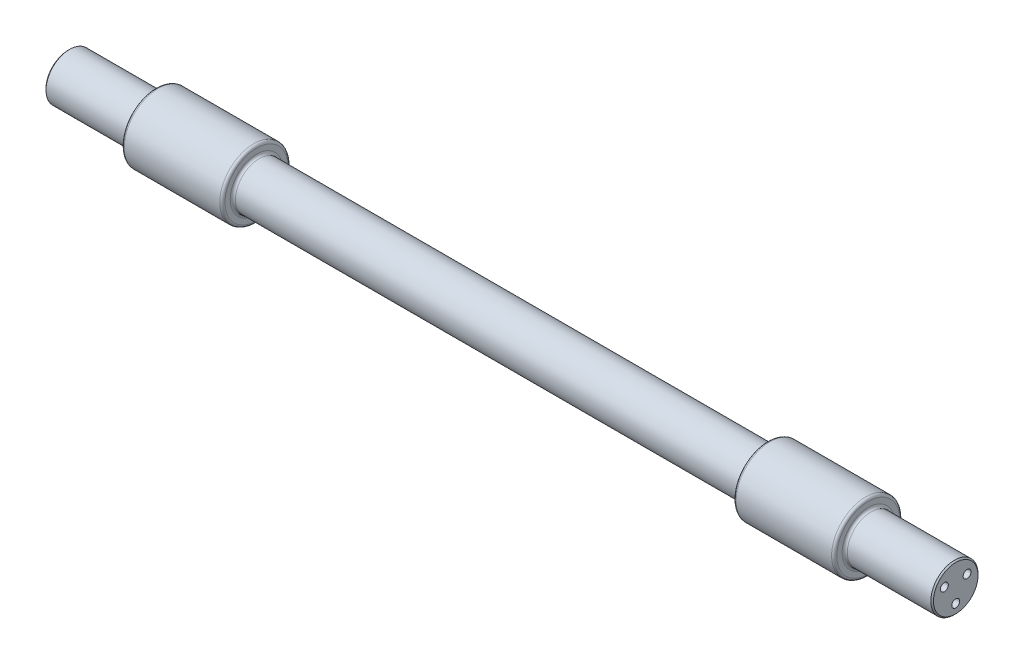
ISO-10303-21;
HEADER;
FILE_DESCRIPTION(('STEP AP214'),'2;1');
FILE_NAME('part.step','',(''),(''),'','','');
FILE_SCHEMA(('AUTOMOTIVE_DESIGN { 1 0 10303 214 1 1 1 1 }'));
ENDSEC;
DATA;
#1=APPLICATION_CONTEXT('core data for automotive mechanical design processes');
#2=APPLICATION_PROTOCOL_DEFINITION('international standard','automotive_design',2000,#1);
#3=PRODUCT_CONTEXT('',#1,'mechanical');
#4=PRODUCT('Part','Part','',(#3));
#5=PRODUCT_RELATED_PRODUCT_CATEGORY('part','',(#4));
#6=PRODUCT_DEFINITION_FORMATION('','',#4);
#7=PRODUCT_DEFINITION_CONTEXT('part definition',#1,'design');
#8=PRODUCT_DEFINITION('design','',#6,#7);
#9=PRODUCT_DEFINITION_SHAPE('','',#8);
#10=(LENGTH_UNIT() NAMED_UNIT(*) SI_UNIT(.MILLI.,.METRE.));
#11=(NAMED_UNIT(*) PLANE_ANGLE_UNIT() SI_UNIT($,.RADIAN.));
#12=(NAMED_UNIT(*) SI_UNIT($,.STERADIAN.) SOLID_ANGLE_UNIT());
#13=UNCERTAINTY_MEASURE_WITH_UNIT(LENGTH_MEASURE(1.E-05),#10,'distance_accuracy_value','');
#14=(GEOMETRIC_REPRESENTATION_CONTEXT(3) GLOBAL_UNCERTAINTY_ASSIGNED_CONTEXT((#13)) GLOBAL_UNIT_ASSIGNED_CONTEXT((#10,
#11,#12)) REPRESENTATION_CONTEXT('',''));
#15=CARTESIAN_POINT('',(0.,0.,0.));
#16=DIRECTION('',(0.,0.,1.));
#17=DIRECTION('',(1.,0.,0.));
#18=AXIS2_PLACEMENT_3D('',#15,#16,#17);
#19=CARTESIAN_POINT('',(0.,89.9999999999997,0.));
#20=DIRECTION('',(1.,0.,0.));
#21=DIRECTION('',(0.,1.,0.));
#22=AXIS2_PLACEMENT_3D('',#19,#20,#21);
#23=PLANE('',#22);
#24=CARTESIAN_POINT('',(0.,0.,0.));
#25=DIRECTION('',(1.,0.,0.));
#26=DIRECTION('',(0.,1.,0.));
#27=AXIS2_PLACEMENT_3D('',#24,#25,#26);
#28=CIRCLE('',#27,85.0000000000009);
#29=CARTESIAN_POINT('',(0.,85.0000000000009,0.));
#30=VERTEX_POINT('',#29);
#31=EDGE_CURVE('E37',#30,#30,#28,.T.);
#32=ORIENTED_EDGE('',*,*,#31,.T.);
#33=EDGE_LOOP('',(#32));
#34=FACE_BOUND('',#33,.T.);
#35=CARTESIAN_POINT('',(0.,25.0000000000002,-43.3012701892218));
#36=DIRECTION('',(-1.,0.,0.));
#37=DIRECTION('',(0.,0.500000000000004,-0.866025403784436));
#38=AXIS2_PLACEMENT_3D('',#35,#36,#37);
#39=CIRCLE('',#38,15.);
#40=CARTESIAN_POINT('',(0.,32.5000000000003,-56.2916512459884));
#41=VERTEX_POINT('',#40);
#42=EDGE_CURVE('E123',#41,#41,#39,.T.);
#43=ORIENTED_EDGE('',*,*,#42,.T.);
#44=EDGE_LOOP('',(#43));
#45=FACE_BOUND('',#44,.T.);
#46=CARTESIAN_POINT('',(0.,-50.,0.));
#47=DIRECTION('',(-1.,0.,0.));
#48=DIRECTION('',(0.,-1.,0.));
#49=AXIS2_PLACEMENT_3D('',#46,#47,#48);
#50=CIRCLE('',#49,15.);
#51=CARTESIAN_POINT('',(0.,-65.,0.));
#52=VERTEX_POINT('',#51);
#53=EDGE_CURVE('E117',#52,#52,#50,.T.);
#54=ORIENTED_EDGE('',*,*,#53,.T.);
#55=EDGE_LOOP('',(#54));
#56=FACE_BOUND('',#55,.T.);
#57=CARTESIAN_POINT('',(0.,24.9999999999996,43.3012701892222));
#58=DIRECTION('',(-1.,0.,0.));
#59=DIRECTION('',(0.,0.499999999999992,0.866025403784443));
#60=AXIS2_PLACEMENT_3D('',#57,#58,#59);
#61=CIRCLE('',#60,15.);
#62=CARTESIAN_POINT('',(0.,32.4999999999995,56.2916512459888));
#63=VERTEX_POINT('',#62);
#64=EDGE_CURVE('E129',#63,#63,#61,.T.);
#65=ORIENTED_EDGE('',*,*,#64,.T.);
#66=EDGE_LOOP('',(#65));
#67=FACE_BOUND('',#66,.T.);
#68=ADVANCED_FACE('F30',(#34,#45,#56,#67),#23,.T.);
#69=CARTESIAN_POINT('',(-3385.,-4.14542941511379E-13,0.));
#70=DIRECTION('',(-1.,0.,0.));
#71=DIRECTION('',(0.,-1.,0.));
#72=AXIS2_PLACEMENT_3D('',#69,#70,#71);
#73=PLANE('',#72);
#74=CARTESIAN_POINT('',(-3385.,-4.14542941511379E-13,0.));
#75=DIRECTION('',(-1.,0.,0.));
#76=DIRECTION('',(0.,-1.,0.));
#77=AXIS2_PLACEMENT_3D('',#74,#75,#76);
#78=CIRCLE('',#77,84.9999999999991);
#79=CARTESIAN_POINT('',(-3385.,-84.9999999999995,0.));
#80=VERTEX_POINT('',#79);
#81=EDGE_CURVE('E41',#80,#80,#78,.T.);
#82=ORIENTED_EDGE('',*,*,#81,.T.);
#83=EDGE_LOOP('',(#82));
#84=FACE_BOUND('',#83,.T.);
#85=CARTESIAN_POINT('',(-3385.,24.9999999999992,43.3012701892222));
#86=DIRECTION('',(-1.,0.,0.));
#87=DIRECTION('',(0.,0.499999999999992,0.866025403784443));
#88=AXIS2_PLACEMENT_3D('',#85,#86,#87);
#89=CIRCLE('',#88,15.);
#90=CARTESIAN_POINT('',(-3385.,32.4999999999991,56.2916512459888));
#91=VERTEX_POINT('',#90);
#92=EDGE_CURVE('E111',#91,#91,#89,.T.);
#93=ORIENTED_EDGE('',*,*,#92,.F.);
#94=EDGE_LOOP('',(#93));
#95=FACE_BOUND('',#94,.T.);
#96=CARTESIAN_POINT('',(-3385.,24.9999999999998,-43.3012701892218));
#97=DIRECTION('',(-1.,0.,0.));
#98=DIRECTION('',(0.,0.500000000000004,-0.866025403784436));
#99=AXIS2_PLACEMENT_3D('',#96,#97,#98);
#100=CIRCLE('',#99,15.);
#101=CARTESIAN_POINT('',(-3385.,32.4999999999999,-56.2916512459884));
#102=VERTEX_POINT('',#101);
#103=EDGE_CURVE('E105',#102,#102,#100,.T.);
#104=ORIENTED_EDGE('',*,*,#103,.F.);
#105=EDGE_LOOP('',(#104));
#106=FACE_BOUND('',#105,.T.);
#107=CARTESIAN_POINT('',(-3385.,-50.0000000000004,0.));
#108=DIRECTION('',(-1.,0.,0.));
#109=DIRECTION('',(0.,-1.,0.));
#110=AXIS2_PLACEMENT_3D('',#107,#108,#109);
#111=CIRCLE('',#110,15.);
#112=CARTESIAN_POINT('',(-3385.,-65.0000000000004,0.));
#113=VERTEX_POINT('',#112);
#114=EDGE_CURVE('E99',#113,#113,#111,.T.);
#115=ORIENTED_EDGE('',*,*,#114,.F.);
#116=EDGE_LOOP('',(#115));
#117=FACE_BOUND('',#116,.T.);
#118=ADVANCED_FACE('F152',(#84,#95,#106,#117),#73,.T.);
#119=CARTESIAN_POINT('',(0.,0.,0.));
#120=DIRECTION('',(1.,0.,0.));
#121=DIRECTION('',(0.,1.,0.));
#122=AXIS2_PLACEMENT_3D('',#119,#120,#121);
#123=CYLINDRICAL_SURFACE('',#122,90.0000000000001);
#124=CARTESIAN_POINT('',(-3380.,-4.13930618111805E-13,0.));
#125=DIRECTION('',(-1.,0.,0.));
#126=DIRECTION('',(0.,-1.,0.));
#127=AXIS2_PLACEMENT_3D('',#124,#125,#126);
#128=CIRCLE('',#127,90.0000000000001);
#129=CARTESIAN_POINT('',(-3380.,-90.0000000000005,0.));
#130=VERTEX_POINT('',#129);
#131=EDGE_CURVE('E45',#130,#130,#128,.F.);
#132=ORIENTED_EDGE('',*,*,#131,.T.);
#133=EDGE_LOOP('',(#132));
#134=FACE_BOUND('',#133,.T.);
#135=CARTESIAN_POINT('',(-3061.5,-3.74925617558962E-13,0.));
#136=DIRECTION('',(-1.,0.,0.));
#137=DIRECTION('',(0.,-1.,0.));
#138=AXIS2_PLACEMENT_3D('',#135,#136,#137);
#139=CIRCLE('',#138,90.0000000000001);
#140=CARTESIAN_POINT('',(-3061.5,-90.0000000000004,0.));
#141=VERTEX_POINT('',#140);
#142=EDGE_CURVE('E71',#141,#141,#139,.T.);
#143=ORIENTED_EDGE('',*,*,#142,.T.);
#144=EDGE_LOOP('',(#143));
#145=FACE_BOUND('',#144,.T.);
#146=ADVANCED_FACE('F157',(#134,#145),#123,.T.);
#147=CARTESIAN_POINT('',(-3051.5,89.9999999999997,0.));
#148=DIRECTION('',(-1.,0.,0.));
#149=DIRECTION('',(0.,-1.,0.));
#150=AXIS2_PLACEMENT_3D('',#147,#148,#149);
#151=PLANE('',#150);
#152=CARTESIAN_POINT('',(-3051.5,-3.73700970759815E-13,0.));
#153=DIRECTION('',(-1.,0.,0.));
#154=DIRECTION('',(0.,-1.,0.));
#155=AXIS2_PLACEMENT_3D('',#152,#153,#154);
#156=CIRCLE('',#155,120.);
#157=CARTESIAN_POINT('',(-3051.5,-120.,0.));
#158=VERTEX_POINT('',#157);
#159=EDGE_CURVE('E74',#158,#158,#156,.T.);
#160=ORIENTED_EDGE('',*,*,#159,.T.);
#161=EDGE_LOOP('',(#160));
#162=FACE_BOUND('',#161,.T.);
#163=CARTESIAN_POINT('',(-3051.5,-3.73700970759815E-13,0.));
#164=DIRECTION('',(-1.,0.,0.));
#165=DIRECTION('',(0.,-1.,0.));
#166=AXIS2_PLACEMENT_3D('',#163,#164,#165);
#167=CIRCLE('',#166,100.);
#168=CARTESIAN_POINT('',(-3051.5,-100.,0.));
#169=VERTEX_POINT('',#168);
#170=EDGE_CURVE('E77',#169,#169,#167,.F.);
#171=ORIENTED_EDGE('',*,*,#170,.T.);
#172=EDGE_LOOP('',(#171));
#173=FACE_BOUND('',#172,.T.);
#174=ADVANCED_FACE('F202',(#162,#173),#151,.T.);
#175=CARTESIAN_POINT('',(0.,0.,0.));
#176=DIRECTION('',(1.,0.,0.));
#177=DIRECTION('',(0.,1.,0.));
#178=AXIS2_PLACEMENT_3D('',#175,#176,#177);
#179=CYLINDRICAL_SURFACE('',#178,130.);
#180=CARTESIAN_POINT('',(-2677.25,-3.27868564301725E-13,0.));
#181=DIRECTION('',(1.,0.,0.));
#182=DIRECTION('',(0.,1.,0.));
#183=AXIS2_PLACEMENT_3D('',#180,#181,#182);
#184=CIRCLE('',#183,130.);
#185=CARTESIAN_POINT('',(-2677.25,130.,0.));
#186=VERTEX_POINT('',#185);
#187=EDGE_CURVE('E80',#186,#186,#184,.F.);
#188=ORIENTED_EDGE('',*,*,#187,.T.);
#189=EDGE_LOOP('',(#188));
#190=FACE_BOUND('',#189,.T.);
#191=CARTESIAN_POINT('',(-3041.5,-3.72476323960667E-13,0.));
#192=DIRECTION('',(-1.,0.,0.));
#193=DIRECTION('',(0.,-1.,0.));
#194=AXIS2_PLACEMENT_3D('',#191,#192,#193);
#195=CIRCLE('',#194,130.);
#196=CARTESIAN_POINT('',(-3041.5,-130.,0.));
#197=VERTEX_POINT('',#196);
#198=EDGE_CURVE('E83',#197,#197,#195,.F.);
#199=ORIENTED_EDGE('',*,*,#198,.T.);
#200=EDGE_LOOP('',(#199));
#201=FACE_BOUND('',#200,.T.);
#202=ADVANCED_FACE('F208',(#190,#201),#179,.T.);
#203=CARTESIAN_POINT('',(-2667.25,130.,0.));
#204=DIRECTION('',(1.,0.,0.));
#205=DIRECTION('',(0.,1.,0.));
#206=AXIS2_PLACEMENT_3D('',#203,#204,#205);
#207=PLANE('',#206);
#208=CARTESIAN_POINT('',(-2667.25,-3.26643917502578E-13,0.));
#209=DIRECTION('',(1.,0.,0.));
#210=DIRECTION('',(0.,1.,0.));
#211=AXIS2_PLACEMENT_3D('',#208,#209,#210);
#212=CIRCLE('',#211,99.9999999999999);
#213=CARTESIAN_POINT('',(-2667.25,99.9999999999995,0.));
#214=VERTEX_POINT('',#213);
#215=EDGE_CURVE('E86',#214,#214,#212,.F.);
#216=ORIENTED_EDGE('',*,*,#215,.T.);
#217=EDGE_LOOP('',(#216));
#218=FACE_BOUND('',#217,.T.);
#219=CARTESIAN_POINT('',(-2667.25,-3.26643917502578E-13,0.));
#220=DIRECTION('',(1.,0.,0.));
#221=DIRECTION('',(0.,1.,0.));
#222=AXIS2_PLACEMENT_3D('',#219,#220,#221);
#223=CIRCLE('',#222,120.);
#224=CARTESIAN_POINT('',(-2667.25,120.,0.));
#225=VERTEX_POINT('',#224);
#226=EDGE_CURVE('E89',#225,#225,#223,.T.);
#227=ORIENTED_EDGE('',*,*,#226,.T.);
#228=EDGE_LOOP('',(#227));
#229=FACE_BOUND('',#228,.T.);
#230=ADVANCED_FACE('F214',(#218,#229),#207,.T.);
#231=CARTESIAN_POINT('',(0.,0.,0.));
#232=DIRECTION('',(1.,0.,0.));
#233=DIRECTION('',(0.,1.,0.));
#234=AXIS2_PLACEMENT_3D('',#231,#232,#233);
#235=CYLINDRICAL_SURFACE('',#234,89.9999999999999);
#236=CARTESIAN_POINT('',(-2657.25,-3.2541927070343E-13,0.));
#237=DIRECTION('',(1.,0.,0.));
#238=DIRECTION('',(0.,1.,0.));
#239=AXIS2_PLACEMENT_3D('',#236,#237,#238);
#240=CIRCLE('',#239,89.9999999999999);
#241=CARTESIAN_POINT('',(-2657.25,89.9999999999996,0.));
#242=VERTEX_POINT('',#241);
#243=EDGE_CURVE('E92',#242,#242,#240,.T.);
#244=ORIENTED_EDGE('',*,*,#243,.T.);
#245=EDGE_LOOP('',(#244));
#246=FACE_BOUND('',#245,.T.);
#247=CARTESIAN_POINT('',(-727.75,0.,0.));
#248=DIRECTION('',(-1.,0.,0.));
#249=DIRECTION('',(0.,-1.,0.));
#250=AXIS2_PLACEMENT_3D('',#247,#248,#249);
#251=CIRCLE('',#250,89.9999999999999);
#252=CARTESIAN_POINT('',(-727.75,-90.,0.));
#253=VERTEX_POINT('',#252);
#254=EDGE_CURVE('E95',#253,#253,#251,.T.);
#255=ORIENTED_EDGE('',*,*,#254,.T.);
#256=EDGE_LOOP('',(#255));
#257=FACE_BOUND('',#256,.T.);
#258=ADVANCED_FACE('F220',(#246,#257),#235,.T.);
#259=CARTESIAN_POINT('',(-717.75,89.9999999999997,0.));
#260=DIRECTION('',(-1.,0.,0.));
#261=DIRECTION('',(0.,-1.,0.));
#262=AXIS2_PLACEMENT_3D('',#259,#260,#261);
#263=PLANE('',#262);
#264=CARTESIAN_POINT('',(-717.75,0.,0.));
#265=DIRECTION('',(-1.,0.,0.));
#266=DIRECTION('',(0.,-1.,0.));
#267=AXIS2_PLACEMENT_3D('',#264,#265,#266);
#268=CIRCLE('',#267,120.);
#269=CARTESIAN_POINT('',(-717.75,-120.,0.));
#270=VERTEX_POINT('',#269);
#271=EDGE_CURVE('E59',#270,#270,#268,.T.);
#272=ORIENTED_EDGE('',*,*,#271,.T.);
#273=EDGE_LOOP('',(#272));
#274=FACE_BOUND('',#273,.T.);
#275=CARTESIAN_POINT('',(-717.75,0.,0.));
#276=DIRECTION('',(-1.,0.,0.));
#277=DIRECTION('',(0.,-1.,0.));
#278=AXIS2_PLACEMENT_3D('',#275,#276,#277);
#279=CIRCLE('',#278,99.9999999999999);
#280=CARTESIAN_POINT('',(-717.75,-100.,0.));
#281=VERTEX_POINT('',#280);
#282=EDGE_CURVE('E62',#281,#281,#279,.F.);
#283=ORIENTED_EDGE('',*,*,#282,.T.);
#284=EDGE_LOOP('',(#283));
#285=FACE_BOUND('',#284,.T.);
#286=ADVANCED_FACE('F224',(#274,#285),#263,.T.);
#287=CARTESIAN_POINT('',(0.,0.,0.));
#288=DIRECTION('',(1.,0.,0.));
#289=DIRECTION('',(0.,1.,0.));
#290=AXIS2_PLACEMENT_3D('',#287,#288,#289);
#291=CYLINDRICAL_SURFACE('',#290,130.);
#292=CARTESIAN_POINT('',(-707.75,0.,0.));
#293=DIRECTION('',(-1.,0.,0.));
#294=DIRECTION('',(0.,-1.,0.));
#295=AXIS2_PLACEMENT_3D('',#292,#293,#294);
#296=CIRCLE('',#295,130.);
#297=CARTESIAN_POINT('',(-707.75,-130.,0.));
#298=VERTEX_POINT('',#297);
#299=EDGE_CURVE('E65',#298,#298,#296,.F.);
#300=ORIENTED_EDGE('',*,*,#299,.T.);
#301=EDGE_LOOP('',(#300));
#302=FACE_BOUND('',#301,.T.);
#303=CARTESIAN_POINT('',(-343.5,0.,0.));
#304=DIRECTION('',(1.,0.,0.));
#305=DIRECTION('',(0.,1.,0.));
#306=AXIS2_PLACEMENT_3D('',#303,#304,#305);
#307=CIRCLE('',#306,130.);
#308=CARTESIAN_POINT('',(-343.5,130.,0.));
#309=VERTEX_POINT('',#308);
#310=EDGE_CURVE('E68',#309,#309,#307,.F.);
#311=ORIENTED_EDGE('',*,*,#310,.T.);
#312=EDGE_LOOP('',(#311));
#313=FACE_BOUND('',#312,.T.);
#314=ADVANCED_FACE('F228',(#302,#313),#291,.T.);
#315=CARTESIAN_POINT('',(-333.5,130.,0.));
#316=DIRECTION('',(1.,0.,0.));
#317=DIRECTION('',(0.,1.,0.));
#318=AXIS2_PLACEMENT_3D('',#315,#316,#317);
#319=PLANE('',#318);
#320=CARTESIAN_POINT('',(-333.5,0.,0.));
#321=DIRECTION('',(1.,0.,0.));
#322=DIRECTION('',(0.,1.,0.));
#323=AXIS2_PLACEMENT_3D('',#320,#321,#322);
#324=CIRCLE('',#323,99.9999999999997);
#325=CARTESIAN_POINT('',(-333.5,99.9999999999997,0.));
#326=VERTEX_POINT('',#325);
#327=EDGE_CURVE('E50',#326,#326,#324,.F.);
#328=ORIENTED_EDGE('',*,*,#327,.T.);
#329=EDGE_LOOP('',(#328));
#330=FACE_BOUND('',#329,.T.);
#331=CARTESIAN_POINT('',(-333.5,0.,0.));
#332=DIRECTION('',(1.,0.,0.));
#333=DIRECTION('',(0.,1.,0.));
#334=AXIS2_PLACEMENT_3D('',#331,#332,#333);
#335=CIRCLE('',#334,120.);
#336=CARTESIAN_POINT('',(-333.5,120.,0.));
#337=VERTEX_POINT('',#336);
#338=EDGE_CURVE('E53',#337,#337,#335,.T.);
#339=ORIENTED_EDGE('',*,*,#338,.T.);
#340=EDGE_LOOP('',(#339));
#341=FACE_BOUND('',#340,.T.);
#342=ADVANCED_FACE('F232',(#330,#341),#319,.T.);
#343=CARTESIAN_POINT('',(0.,0.,0.));
#344=DIRECTION('',(1.,0.,0.));
#345=DIRECTION('',(0.,1.,0.));
#346=AXIS2_PLACEMENT_3D('',#343,#344,#345);
#347=CYLINDRICAL_SURFACE('',#346,89.9999999999997);
#348=CARTESIAN_POINT('',(-4.99999999999907,0.,0.));
#349=DIRECTION('',(1.,0.,0.));
#350=DIRECTION('',(0.,1.,0.));
#351=AXIS2_PLACEMENT_3D('',#348,#349,#350);
#352=CIRCLE('',#351,89.9999999999997);
#353=CARTESIAN_POINT('',(-4.99999999999908,89.9999999999997,0.));
#354=VERTEX_POINT('',#353);
#355=EDGE_CURVE('E10',#354,#354,#352,.F.);
#356=ORIENTED_EDGE('',*,*,#355,.T.);
#357=EDGE_LOOP('',(#356));
#358=FACE_BOUND('',#357,.T.);
#359=CARTESIAN_POINT('',(-323.5,0.,0.));
#360=DIRECTION('',(1.,0.,0.));
#361=DIRECTION('',(0.,1.,0.));
#362=AXIS2_PLACEMENT_3D('',#359,#360,#361);
#363=CIRCLE('',#362,89.9999999999997);
#364=CARTESIAN_POINT('',(-323.5,89.9999999999997,0.));
#365=VERTEX_POINT('',#364);
#366=EDGE_CURVE('E56',#365,#365,#363,.T.);
#367=ORIENTED_EDGE('',*,*,#366,.T.);
#368=EDGE_LOOP('',(#367));
#369=FACE_BOUND('',#368,.T.);
#370=ADVANCED_FACE('F236',(#358,#369),#347,.T.);
#371=CARTESIAN_POINT('',(-3335.,-50.0000000000004,0.));
#372=DIRECTION('',(-1.,0.,0.));
#373=DIRECTION('',(0.,-1.,0.));
#374=AXIS2_PLACEMENT_3D('',#371,#372,#373);
#375=CYLINDRICAL_SURFACE('',#374,15.);
#376=CARTESIAN_POINT('',(-3335.,-50.0000000000004,0.));
#377=DIRECTION('',(-1.,0.,0.));
#378=DIRECTION('',(0.,-1.,0.));
#379=AXIS2_PLACEMENT_3D('',#376,#377,#378);
#380=CIRCLE('',#379,15.);
#381=CARTESIAN_POINT('',(-3335.,-65.0000000000004,0.));
#382=VERTEX_POINT('',#381);
#383=EDGE_CURVE('E98',#382,#382,#380,.T.);
#384=ORIENTED_EDGE('',*,*,#383,.F.);
#385=EDGE_LOOP('',(#384));
#386=FACE_BOUND('',#385,.T.);
#387=ORIENTED_EDGE('',*,*,#114,.T.);
#388=EDGE_LOOP('',(#387));
#389=FACE_BOUND('',#388,.T.);
#390=ADVANCED_FACE('F240',(#386,#389),#375,.F.);
#391=CARTESIAN_POINT('',(-3335.,-50.0000000000004,0.));
#392=DIRECTION('',(-1.,0.,0.));
#393=DIRECTION('',(0.,-1.,0.));
#394=AXIS2_PLACEMENT_3D('',#391,#392,#393);
#395=PLANE('',#394);
#396=ORIENTED_EDGE('',*,*,#383,.T.);
#397=EDGE_LOOP('',(#396));
#398=FACE_BOUND('',#397,.T.);
#399=ADVANCED_FACE('F243',(#398),#395,.T.);
#400=CARTESIAN_POINT('',(-3335.,24.9999999999998,-43.3012701892218));
#401=DIRECTION('',(-1.,0.,0.));
#402=DIRECTION('',(0.,-1.,0.));
#403=AXIS2_PLACEMENT_3D('',#400,#401,#402);
#404=CYLINDRICAL_SURFACE('',#403,15.);
#405=CARTESIAN_POINT('',(-3335.,24.9999999999998,-43.3012701892218));
#406=DIRECTION('',(-1.,0.,0.));
#407=DIRECTION('',(0.,0.500000000000004,-0.866025403784436));
#408=AXIS2_PLACEMENT_3D('',#405,#406,#407);
#409=CIRCLE('',#408,15.);
#410=CARTESIAN_POINT('',(-3335.,32.4999999999999,-56.2916512459884));
#411=VERTEX_POINT('',#410);
#412=EDGE_CURVE('E102',#411,#411,#409,.T.);
#413=ORIENTED_EDGE('',*,*,#412,.F.);
#414=EDGE_LOOP('',(#413));
#415=FACE_BOUND('',#414,.T.);
#416=ORIENTED_EDGE('',*,*,#103,.T.);
#417=EDGE_LOOP('',(#416));
#418=FACE_BOUND('',#417,.T.);
#419=ADVANCED_FACE('F247',(#415,#418),#404,.F.);
#420=CARTESIAN_POINT('',(-3335.,24.9999999999998,-43.3012701892218));
#421=DIRECTION('',(-1.,0.,0.));
#422=DIRECTION('',(0.,0.500000000000004,-0.866025403784436));
#423=AXIS2_PLACEMENT_3D('',#420,#421,#422);
#424=PLANE('',#423);
#425=ORIENTED_EDGE('',*,*,#412,.T.);
#426=EDGE_LOOP('',(#425));
#427=FACE_BOUND('',#426,.T.);
#428=ADVANCED_FACE('F251',(#427),#424,.T.);
#429=CARTESIAN_POINT('',(-3335.,24.9999999999992,43.3012701892222));
#430=DIRECTION('',(-1.,0.,0.));
#431=DIRECTION('',(0.,-1.,0.));
#432=AXIS2_PLACEMENT_3D('',#429,#430,#431);
#433=CYLINDRICAL_SURFACE('',#432,15.);
#434=CARTESIAN_POINT('',(-3335.,24.9999999999992,43.3012701892222));
#435=DIRECTION('',(-1.,0.,0.));
#436=DIRECTION('',(0.,0.499999999999992,0.866025403784443));
#437=AXIS2_PLACEMENT_3D('',#434,#435,#436);
#438=CIRCLE('',#437,15.);
#439=CARTESIAN_POINT('',(-3335.,32.4999999999991,56.2916512459888));
#440=VERTEX_POINT('',#439);
#441=EDGE_CURVE('E108',#440,#440,#438,.T.);
#442=ORIENTED_EDGE('',*,*,#441,.F.);
#443=EDGE_LOOP('',(#442));
#444=FACE_BOUND('',#443,.T.);
#445=ORIENTED_EDGE('',*,*,#92,.T.);
#446=EDGE_LOOP('',(#445));
#447=FACE_BOUND('',#446,.T.);
#448=ADVANCED_FACE('F255',(#444,#447),#433,.F.);
#449=CARTESIAN_POINT('',(-3335.,24.9999999999992,43.3012701892222));
#450=DIRECTION('',(-1.,0.,0.));
#451=DIRECTION('',(0.,0.499999999999992,0.866025403784443));
#452=AXIS2_PLACEMENT_3D('',#449,#450,#451);
#453=PLANE('',#452);
#454=ORIENTED_EDGE('',*,*,#441,.T.);
#455=EDGE_LOOP('',(#454));
#456=FACE_BOUND('',#455,.T.);
#457=ADVANCED_FACE('F259',(#456),#453,.T.);
#458=CARTESIAN_POINT('',(-50.,-50.,0.));
#459=DIRECTION('',(1.,0.,0.));
#460=DIRECTION('',(0.,1.,0.));
#461=AXIS2_PLACEMENT_3D('',#458,#459,#460);
#462=CYLINDRICAL_SURFACE('',#461,15.);
#463=CARTESIAN_POINT('',(-50.,-50.,0.));
#464=DIRECTION('',(-1.,0.,0.));
#465=DIRECTION('',(0.,-1.,0.));
#466=AXIS2_PLACEMENT_3D('',#463,#464,#465);
#467=CIRCLE('',#466,15.);
#468=CARTESIAN_POINT('',(-50.,-65.,0.));
#469=VERTEX_POINT('',#468);
#470=EDGE_CURVE('E114',#469,#469,#467,.T.);
#471=ORIENTED_EDGE('',*,*,#470,.T.);
#472=EDGE_LOOP('',(#471));
#473=FACE_BOUND('',#472,.T.);
#474=ORIENTED_EDGE('',*,*,#53,.F.);
#475=EDGE_LOOP('',(#474));
#476=FACE_BOUND('',#475,.T.);
#477=ADVANCED_FACE('F263',(#473,#476),#462,.F.);
#478=CARTESIAN_POINT('',(-50.,-50.,0.));
#479=DIRECTION('',(1.,0.,0.));
#480=DIRECTION('',(0.,-1.,0.));
#481=AXIS2_PLACEMENT_3D('',#478,#479,#480);
#482=PLANE('',#481);
#483=ORIENTED_EDGE('',*,*,#470,.F.);
#484=EDGE_LOOP('',(#483));
#485=FACE_BOUND('',#484,.T.);
#486=ADVANCED_FACE('F267',(#485),#482,.T.);
#487=CARTESIAN_POINT('',(-50.,25.0000000000002,-43.3012701892218));
#488=DIRECTION('',(1.,0.,0.));
#489=DIRECTION('',(0.,1.,0.));
#490=AXIS2_PLACEMENT_3D('',#487,#488,#489);
#491=CYLINDRICAL_SURFACE('',#490,15.);
#492=CARTESIAN_POINT('',(-50.,25.0000000000002,-43.3012701892218));
#493=DIRECTION('',(-1.,0.,0.));
#494=DIRECTION('',(0.,0.500000000000004,-0.866025403784436));
#495=AXIS2_PLACEMENT_3D('',#492,#493,#494);
#496=CIRCLE('',#495,15.);
#497=CARTESIAN_POINT('',(-50.,32.5000000000003,-56.2916512459884));
#498=VERTEX_POINT('',#497);
#499=EDGE_CURVE('E120',#498,#498,#496,.T.);
#500=ORIENTED_EDGE('',*,*,#499,.T.);
#501=EDGE_LOOP('',(#500));
#502=FACE_BOUND('',#501,.T.);
#503=ORIENTED_EDGE('',*,*,#42,.F.);
#504=EDGE_LOOP('',(#503));
#505=FACE_BOUND('',#504,.T.);
#506=ADVANCED_FACE('F271',(#502,#505),#491,.F.);
#507=CARTESIAN_POINT('',(-50.,25.0000000000002,-43.3012701892218));
#508=DIRECTION('',(1.,0.,0.));
#509=DIRECTION('',(0.,0.500000000000004,-0.866025403784436));
#510=AXIS2_PLACEMENT_3D('',#507,#508,#509);
#511=PLANE('',#510);
#512=ORIENTED_EDGE('',*,*,#499,.F.);
#513=EDGE_LOOP('',(#512));
#514=FACE_BOUND('',#513,.T.);
#515=ADVANCED_FACE('F149',(#514),#511,.T.);
#516=CARTESIAN_POINT('',(-50.,24.9999999999996,43.3012701892222));
#517=DIRECTION('',(1.,0.,0.));
#518=DIRECTION('',(0.,1.,0.));
#519=AXIS2_PLACEMENT_3D('',#516,#517,#518);
#520=CYLINDRICAL_SURFACE('',#519,15.);
#521=CARTESIAN_POINT('',(-50.,24.9999999999996,43.3012701892222));
#522=DIRECTION('',(-1.,0.,0.));
#523=DIRECTION('',(0.,0.499999999999992,0.866025403784443));
#524=AXIS2_PLACEMENT_3D('',#521,#522,#523);
#525=CIRCLE('',#524,15.);
#526=CARTESIAN_POINT('',(-50.,32.4999999999995,56.2916512459888));
#527=VERTEX_POINT('',#526);
#528=EDGE_CURVE('E126',#527,#527,#525,.T.);
#529=ORIENTED_EDGE('',*,*,#528,.T.);
#530=EDGE_LOOP('',(#529));
#531=FACE_BOUND('',#530,.T.);
#532=ORIENTED_EDGE('',*,*,#64,.F.);
#533=EDGE_LOOP('',(#532));
#534=FACE_BOUND('',#533,.T.);
#535=ADVANCED_FACE('F135',(#531,#534),#520,.F.);
#536=CARTESIAN_POINT('',(-50.,24.9999999999996,43.3012701892222));
#537=DIRECTION('',(1.,0.,0.));
#538=DIRECTION('',(0.,0.499999999999992,0.866025403784443));
#539=AXIS2_PLACEMENT_3D('',#536,#537,#538);
#540=PLANE('',#539);
#541=ORIENTED_EDGE('',*,*,#528,.F.);
#542=EDGE_LOOP('',(#541));
#543=FACE_BOUND('',#542,.T.);
#544=ADVANCED_FACE('F138',(#543),#540,.T.);
#545=CARTESIAN_POINT('',(-2657.25,-3.2541927070343E-13,0.));
#546=DIRECTION('',(1.,0.,0.));
#547=DIRECTION('',(0.,1.,0.));
#548=AXIS2_PLACEMENT_3D('',#545,#546,#547);
#549=TOROIDAL_SURFACE('',#548,99.9999999999999,10.);
#550=ORIENTED_EDGE('',*,*,#215,.F.);
#551=EDGE_LOOP('',(#550));
#552=FACE_BOUND('',#551,.T.);
#553=ORIENTED_EDGE('',*,*,#243,.F.);
#554=EDGE_LOOP('',(#553));
#555=FACE_BOUND('',#554,.T.);
#556=ADVANCED_FACE('F140',(#552,#555),#549,.F.);
#557=CARTESIAN_POINT('',(-2677.25,-3.27868564301725E-13,0.));
#558=DIRECTION('',(1.,0.,0.));
#559=DIRECTION('',(0.,1.,0.));
#560=AXIS2_PLACEMENT_3D('',#557,#558,#559);
#561=TOROIDAL_SURFACE('',#560,120.,10.);
#562=ORIENTED_EDGE('',*,*,#187,.F.);
#563=EDGE_LOOP('',(#562));
#564=FACE_BOUND('',#563,.T.);
#565=ORIENTED_EDGE('',*,*,#226,.F.);
#566=EDGE_LOOP('',(#565));
#567=FACE_BOUND('',#566,.T.);
#568=ADVANCED_FACE('F146',(#564,#567),#561,.T.);
#569=CARTESIAN_POINT('',(-3041.5,-3.72476323960667E-13,0.));
#570=DIRECTION('',(-1.,0.,0.));
#571=DIRECTION('',(0.,-1.,0.));
#572=AXIS2_PLACEMENT_3D('',#569,#570,#571);
#573=TOROIDAL_SURFACE('',#572,120.,10.);
#574=ORIENTED_EDGE('',*,*,#159,.F.);
#575=EDGE_LOOP('',(#574));
#576=FACE_BOUND('',#575,.T.);
#577=ORIENTED_EDGE('',*,*,#198,.F.);
#578=EDGE_LOOP('',(#577));
#579=FACE_BOUND('',#578,.T.);
#580=ADVANCED_FACE('F165',(#576,#579),#573,.T.);
#581=CARTESIAN_POINT('',(-3061.5,-3.74925617558962E-13,0.));
#582=DIRECTION('',(-1.,0.,0.));
#583=DIRECTION('',(0.,-1.,0.));
#584=AXIS2_PLACEMENT_3D('',#581,#582,#583);
#585=TOROIDAL_SURFACE('',#584,100.,10.);
#586=ORIENTED_EDGE('',*,*,#142,.F.);
#587=EDGE_LOOP('',(#586));
#588=FACE_BOUND('',#587,.T.);
#589=ORIENTED_EDGE('',*,*,#170,.F.);
#590=EDGE_LOOP('',(#589));
#591=FACE_BOUND('',#590,.T.);
#592=ADVANCED_FACE('F169',(#588,#591),#585,.F.);
#593=CARTESIAN_POINT('',(-707.75,0.,0.));
#594=DIRECTION('',(-1.,0.,0.));
#595=DIRECTION('',(0.,-1.,0.));
#596=AXIS2_PLACEMENT_3D('',#593,#594,#595);
#597=TOROIDAL_SURFACE('',#596,120.,10.);
#598=ORIENTED_EDGE('',*,*,#271,.F.);
#599=EDGE_LOOP('',(#598));
#600=FACE_BOUND('',#599,.T.);
#601=ORIENTED_EDGE('',*,*,#299,.F.);
#602=EDGE_LOOP('',(#601));
#603=FACE_BOUND('',#602,.T.);
#604=ADVANCED_FACE('F173',(#600,#603),#597,.T.);
#605=CARTESIAN_POINT('',(-727.75,0.,0.));
#606=DIRECTION('',(-1.,0.,0.));
#607=DIRECTION('',(0.,-1.,0.));
#608=AXIS2_PLACEMENT_3D('',#605,#606,#607);
#609=TOROIDAL_SURFACE('',#608,99.9999999999999,10.);
#610=ORIENTED_EDGE('',*,*,#254,.F.);
#611=EDGE_LOOP('',(#610));
#612=FACE_BOUND('',#611,.T.);
#613=ORIENTED_EDGE('',*,*,#282,.F.);
#614=EDGE_LOOP('',(#613));
#615=FACE_BOUND('',#614,.T.);
#616=ADVANCED_FACE('F177',(#612,#615),#609,.F.);
#617=CARTESIAN_POINT('',(-323.5,0.,0.));
#618=DIRECTION('',(1.,0.,0.));
#619=DIRECTION('',(0.,1.,0.));
#620=AXIS2_PLACEMENT_3D('',#617,#618,#619);
#621=TOROIDAL_SURFACE('',#620,99.9999999999997,10.);
#622=ORIENTED_EDGE('',*,*,#327,.F.);
#623=EDGE_LOOP('',(#622));
#624=FACE_BOUND('',#623,.T.);
#625=ORIENTED_EDGE('',*,*,#366,.F.);
#626=EDGE_LOOP('',(#625));
#627=FACE_BOUND('',#626,.T.);
#628=ADVANCED_FACE('F181',(#624,#627),#621,.F.);
#629=CARTESIAN_POINT('',(-343.5,0.,0.));
#630=DIRECTION('',(1.,0.,0.));
#631=DIRECTION('',(0.,1.,0.));
#632=AXIS2_PLACEMENT_3D('',#629,#630,#631);
#633=TOROIDAL_SURFACE('',#632,120.,10.);
#634=ORIENTED_EDGE('',*,*,#310,.F.);
#635=EDGE_LOOP('',(#634));
#636=FACE_BOUND('',#635,.T.);
#637=ORIENTED_EDGE('',*,*,#338,.F.);
#638=EDGE_LOOP('',(#637));
#639=FACE_BOUND('',#638,.T.);
#640=ADVANCED_FACE('F185',(#636,#639),#633,.T.);
#641=CARTESIAN_POINT('',(-3380.,-4.13930618111805E-13,0.));
#642=DIRECTION('',(1.,0.,0.));
#643=DIRECTION('',(0.,1.,0.));
#644=AXIS2_PLACEMENT_3D('',#641,#642,#643);
#645=CONICAL_SURFACE('',#644,90.0000000000001,0.78539816339747);
#646=ORIENTED_EDGE('',*,*,#81,.F.);
#647=EDGE_LOOP('',(#646));
#648=FACE_BOUND('',#647,.T.);
#649=ORIENTED_EDGE('',*,*,#131,.F.);
#650=EDGE_LOOP('',(#649));
#651=FACE_BOUND('',#650,.T.);
#652=ADVANCED_FACE('F188',(#648,#651),#645,.T.);
#653=CARTESIAN_POINT('',(0.,0.,0.));
#654=DIRECTION('',(-1.,0.,0.));
#655=DIRECTION('',(0.,-1.,0.));
#656=AXIS2_PLACEMENT_3D('',#653,#654,#655);
#657=CONICAL_SURFACE('',#656,85.0000000000009,0.785398163397428);
#658=ORIENTED_EDGE('',*,*,#355,.F.);
#659=EDGE_LOOP('',(#658));
#660=FACE_BOUND('',#659,.T.);
#661=ORIENTED_EDGE('',*,*,#31,.F.);
#662=EDGE_LOOP('',(#661));
#663=FACE_BOUND('',#662,.T.);
#664=ADVANCED_FACE('F32',(#660,#663),#657,.T.);
#665=CLOSED_SHELL('',(#68,#118,#146,#174,#202,#230,#258,#286,#314,#342,#370,#390,#399,#419,#428,
#448,#457,#477,#486,#506,#515,#535,#544,#556,#568,#580,#592,#604,#616,#628,#640,#652,#664));
#666=MANIFOLD_SOLID_BREP('B2',#665);
#667=ADVANCED_BREP_SHAPE_REPRESENTATION('',(#18,#666),#14);
#668=SHAPE_DEFINITION_REPRESENTATION(#9,#667);
ENDSEC;
END-ISO-10303-21;
